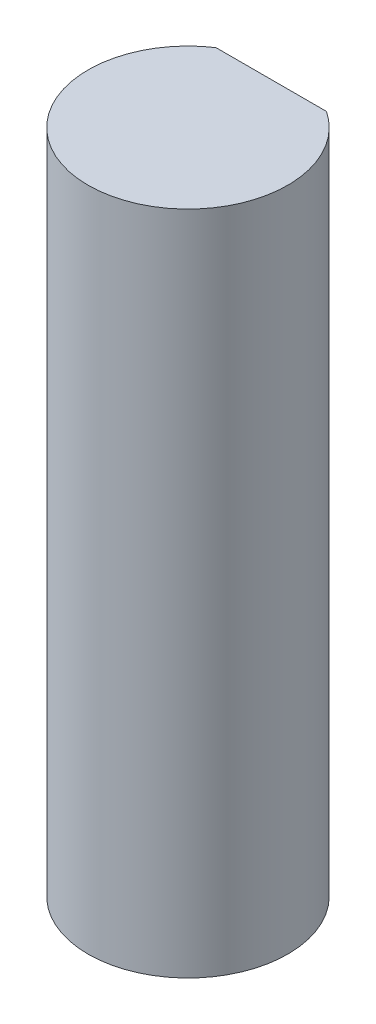
ISO-10303-21;
HEADER;
FILE_DESCRIPTION(('STEP AP214'),'2;1');
FILE_NAME('part.step','',(''),(''),'','','');
FILE_SCHEMA(('AUTOMOTIVE_DESIGN { 1 0 10303 214 1 1 1 1 }'));
ENDSEC;
DATA;
#1=APPLICATION_CONTEXT('core data for automotive mechanical design processes');
#2=APPLICATION_PROTOCOL_DEFINITION('international standard','automotive_design',2000,#1);
#3=PRODUCT_CONTEXT('',#1,'mechanical');
#4=PRODUCT('Part','Part','',(#3));
#5=PRODUCT_RELATED_PRODUCT_CATEGORY('part','',(#4));
#6=PRODUCT_DEFINITION_FORMATION('','',#4);
#7=PRODUCT_DEFINITION_CONTEXT('part definition',#1,'design');
#8=PRODUCT_DEFINITION('design','',#6,#7);
#9=PRODUCT_DEFINITION_SHAPE('','',#8);
#10=(LENGTH_UNIT() NAMED_UNIT(*) SI_UNIT(.MILLI.,.METRE.));
#11=(NAMED_UNIT(*) PLANE_ANGLE_UNIT() SI_UNIT($,.RADIAN.));
#12=(NAMED_UNIT(*) SI_UNIT($,.STERADIAN.) SOLID_ANGLE_UNIT());
#13=UNCERTAINTY_MEASURE_WITH_UNIT(LENGTH_MEASURE(1.E-05),#10,'distance_accuracy_value','');
#14=(GEOMETRIC_REPRESENTATION_CONTEXT(3) GLOBAL_UNCERTAINTY_ASSIGNED_CONTEXT((#13)) GLOBAL_UNIT_ASSIGNED_CONTEXT((#10,
#11,#12)) REPRESENTATION_CONTEXT('',''));
#15=CARTESIAN_POINT('',(0.,0.,0.));
#16=DIRECTION('',(0.,0.,1.));
#17=DIRECTION('',(1.,0.,0.));
#18=AXIS2_PLACEMENT_3D('',#15,#16,#17);
#19=CARTESIAN_POINT('',(0.,20.,0.));
#20=DIRECTION('',(0.,-1.,0.));
#21=DIRECTION('',(0.,0.,-1.));
#22=AXIS2_PLACEMENT_3D('',#19,#20,#21);
#23=CYLINDRICAL_SURFACE('',#22,3.);
#24=CARTESIAN_POINT('',(0.,20.,0.));
#25=DIRECTION('',(0.,1.,0.));
#26=DIRECTION('',(0.,0.,1.));
#27=AXIS2_PLACEMENT_3D('',#24,#25,#26);
#28=CIRCLE('',#27,3.);
#29=CARTESIAN_POINT('',(-1.6583123951777,20.,-2.5));
#30=VERTEX_POINT('',#29);
#31=CARTESIAN_POINT('',(1.6583123951777,20.,-2.5));
#32=VERTEX_POINT('',#31);
#33=EDGE_CURVE('E47',#30,#32,#28,.T.);
#34=ORIENTED_EDGE('',*,*,#33,.F.);
#35=DIRECTION('',(0.,1.,0.));
#36=VECTOR('',#35,1.);
#37=CARTESIAN_POINT('',(-1.6583123951777,6.,-2.5));
#38=LINE('',#37,#36);
#39=CARTESIAN_POINT('',(-1.6583123951777,6.,-2.5));
#40=VERTEX_POINT('',#39);
#41=EDGE_CURVE('E54',#40,#30,#38,.T.);
#42=ORIENTED_EDGE('',*,*,#41,.F.);
#43=CARTESIAN_POINT('',(0.,6.,0.));
#44=DIRECTION('',(0.,-1.,0.));
#45=DIRECTION('',(0.,0.,-1.));
#46=AXIS2_PLACEMENT_3D('',#43,#44,#45);
#47=CIRCLE('',#46,3.);
#48=CARTESIAN_POINT('',(1.6583123951777,6.,-2.5));
#49=VERTEX_POINT('',#48);
#50=EDGE_CURVE('E11',#40,#49,#47,.T.);
#51=ORIENTED_EDGE('',*,*,#50,.T.);
#52=DIRECTION('',(0.,-1.,0.));
#53=VECTOR('',#52,1.);
#54=CARTESIAN_POINT('',(1.6583123951777,20.,-2.5));
#55=LINE('',#54,#53);
#56=EDGE_CURVE('E59',#49,#32,#55,.F.);
#57=ORIENTED_EDGE('',*,*,#56,.T.);
#58=EDGE_LOOP('',(#34,#42,#51,#57));
#59=FACE_BOUND('',#58,.T.);
#60=CARTESIAN_POINT('',(0.,0.,0.));
#61=DIRECTION('',(0.,1.,0.));
#62=DIRECTION('',(0.,0.,1.));
#63=AXIS2_PLACEMENT_3D('',#60,#61,#62);
#64=CIRCLE('',#63,3.);
#65=CARTESIAN_POINT('',(0.,0.,3.));
#66=VERTEX_POINT('',#65);
#67=EDGE_CURVE('E79',#66,#66,#64,.T.);
#68=ORIENTED_EDGE('',*,*,#67,.T.);
#69=EDGE_LOOP('',(#68));
#70=FACE_BOUND('',#69,.T.);
#71=ADVANCED_FACE('F39',(#59,#70),#23,.T.);
#72=CARTESIAN_POINT('',(0.,20.,0.));
#73=DIRECTION('',(0.,1.,0.));
#74=DIRECTION('',(0.,0.,1.));
#75=AXIS2_PLACEMENT_3D('',#72,#73,#74);
#76=PLANE('',#75);
#77=DIRECTION('',(1.,0.,0.));
#78=VECTOR('',#77,1.);
#79=CARTESIAN_POINT('',(-1.6583123951777,20.,-2.5));
#80=LINE('',#79,#78);
#81=EDGE_CURVE('E71',#30,#32,#80,.T.);
#82=ORIENTED_EDGE('',*,*,#81,.F.);
#83=ORIENTED_EDGE('',*,*,#33,.T.);
#84=EDGE_LOOP('',(#82,#83));
#85=FACE_BOUND('',#84,.T.);
#86=ADVANCED_FACE('F90',(#85),#76,.T.);
#87=CARTESIAN_POINT('',(0.,0.,0.));
#88=DIRECTION('',(0.,1.,0.));
#89=DIRECTION('',(0.,0.,1.));
#90=AXIS2_PLACEMENT_3D('',#87,#88,#89);
#91=PLANE('',#90);
#92=ORIENTED_EDGE('',*,*,#67,.F.);
#93=EDGE_LOOP('',(#92));
#94=FACE_BOUND('',#93,.T.);
#95=ADVANCED_FACE('F88',(#94),#91,.F.);
#96=CARTESIAN_POINT('',(0.,6.,0.));
#97=DIRECTION('',(0.,-1.,0.));
#98=DIRECTION('',(0.,0.,-1.));
#99=AXIS2_PLACEMENT_3D('',#96,#97,#98);
#100=PLANE('',#99);
#101=DIRECTION('',(1.,0.,0.));
#102=VECTOR('',#101,1.);
#103=CARTESIAN_POINT('',(-1.6583123951777,6.,-2.5));
#104=LINE('',#103,#102);
#105=EDGE_CURVE('E67',#40,#49,#104,.T.);
#106=ORIENTED_EDGE('',*,*,#105,.T.);
#107=ORIENTED_EDGE('',*,*,#50,.F.);
#108=EDGE_LOOP('',(#106,#107));
#109=FACE_BOUND('',#108,.T.);
#110=ADVANCED_FACE('F66',(#109),#100,.F.);
#111=CARTESIAN_POINT('',(-1.6583123951777,6.,-2.5));
#112=DIRECTION('',(0.,0.,1.));
#113=DIRECTION('',(1.,0.,0.));
#114=AXIS2_PLACEMENT_3D('',#111,#112,#113);
#115=PLANE('',#114);
#116=ORIENTED_EDGE('',*,*,#105,.F.);
#117=ORIENTED_EDGE('',*,*,#41,.T.);
#118=ORIENTED_EDGE('',*,*,#81,.T.);
#119=ORIENTED_EDGE('',*,*,#56,.F.);
#120=EDGE_LOOP('',(#116,#117,#118,#119));
#121=FACE_BOUND('',#120,.T.);
#122=ADVANCED_FACE('F69',(#121),#115,.F.);
#123=CLOSED_SHELL('',(#71,#86,#95,#110,#122));
#124=MANIFOLD_SOLID_BREP('B2',#123);
#125=ADVANCED_BREP_SHAPE_REPRESENTATION('',(#18,#124),#14);
#126=SHAPE_DEFINITION_REPRESENTATION(#9,#125);
ENDSEC;
END-ISO-10303-21;
